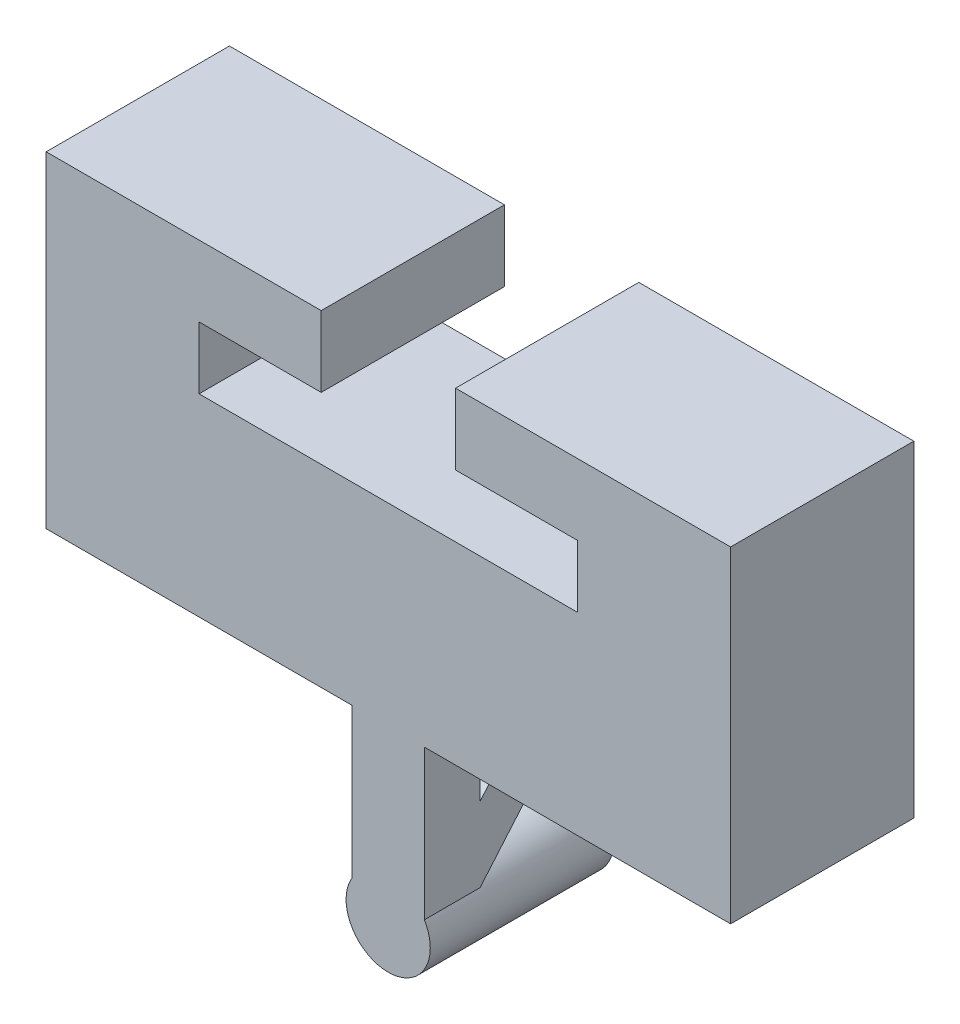
ISO-10303-21;
HEADER;
FILE_DESCRIPTION(('STEP AP214'),'2;1');
FILE_NAME('part.step','',(''),(''),'','','');
FILE_SCHEMA(('AUTOMOTIVE_DESIGN { 1 0 10303 214 1 1 1 1 }'));
ENDSEC;
DATA;
#1=APPLICATION_CONTEXT('core data for automotive mechanical design processes');
#2=APPLICATION_PROTOCOL_DEFINITION('international standard','automotive_design',2000,#1);
#3=PRODUCT_CONTEXT('',#1,'mechanical');
#4=PRODUCT('Part','Part','',(#3));
#5=PRODUCT_RELATED_PRODUCT_CATEGORY('part','',(#4));
#6=PRODUCT_DEFINITION_FORMATION('','',#4);
#7=PRODUCT_DEFINITION_CONTEXT('part definition',#1,'design');
#8=PRODUCT_DEFINITION('design','',#6,#7);
#9=PRODUCT_DEFINITION_SHAPE('','',#8);
#10=(LENGTH_UNIT() NAMED_UNIT(*) SI_UNIT(.MILLI.,.METRE.));
#11=(NAMED_UNIT(*) PLANE_ANGLE_UNIT() SI_UNIT($,.RADIAN.));
#12=(NAMED_UNIT(*) SI_UNIT($,.STERADIAN.) SOLID_ANGLE_UNIT());
#13=UNCERTAINTY_MEASURE_WITH_UNIT(LENGTH_MEASURE(1.E-05),#10,'distance_accuracy_value','');
#14=(GEOMETRIC_REPRESENTATION_CONTEXT(3) GLOBAL_UNCERTAINTY_ASSIGNED_CONTEXT((#13)) GLOBAL_UNIT_ASSIGNED_CONTEXT((#10,
#11,#12)) REPRESENTATION_CONTEXT('',''));
#15=CARTESIAN_POINT('',(0.,0.,0.));
#16=DIRECTION('',(0.,0.,1.));
#17=DIRECTION('',(1.,0.,0.));
#18=AXIS2_PLACEMENT_3D('',#15,#16,#17);
#19=CARTESIAN_POINT('',(0.,0.,38.1));
#20=DIRECTION('',(0.,1.,0.));
#21=DIRECTION('',(0.,0.,1.));
#22=AXIS2_PLACEMENT_3D('',#19,#20,#21);
#23=PLANE('',#22);
#24=DIRECTION('',(1.,0.,0.));
#25=VECTOR('',#24,1.);
#26=CARTESIAN_POINT('',(0.,0.,0.));
#27=LINE('',#26,#25);
#28=CARTESIAN_POINT('',(0.,0.,0.));
#29=VERTEX_POINT('',#28);
#30=CARTESIAN_POINT('',(63.4079942270176,0.,0.));
#31=VERTEX_POINT('',#30);
#32=EDGE_CURVE('E291',#29,#31,#27,.T.);
#33=ORIENTED_EDGE('',*,*,#32,.T.);
#34=DIRECTION('',(0.,0.,1.));
#35=VECTOR('',#34,1.);
#36=CARTESIAN_POINT('',(63.4079942270176,0.,0.));
#37=LINE('',#36,#35);
#38=CARTESIAN_POINT('',(63.4079942270176,0.,13.2638594013395));
#39=VERTEX_POINT('',#38);
#40=EDGE_CURVE('E66',#31,#39,#37,.T.);
#41=ORIENTED_EDGE('',*,*,#40,.T.);
#42=DIRECTION('',(1.,0.,0.));
#43=VECTOR('',#42,1.);
#44=CARTESIAN_POINT('',(63.4079942270176,0.,13.2638594013395));
#45=LINE('',#44,#43);
#46=CARTESIAN_POINT('',(78.6479942270176,0.,13.2638594013395));
#47=VERTEX_POINT('',#46);
#48=EDGE_CURVE('E70',#39,#47,#45,.T.);
#49=ORIENTED_EDGE('',*,*,#48,.T.);
#50=DIRECTION('',(0.,0.,1.));
#51=VECTOR('',#50,1.);
#52=CARTESIAN_POINT('',(78.6479942270176,0.,0.));
#53=LINE('',#52,#51);
#54=CARTESIAN_POINT('',(78.6479942270176,0.,0.));
#55=VERTEX_POINT('',#54);
#56=EDGE_CURVE('E213',#55,#47,#53,.T.);
#57=ORIENTED_EDGE('',*,*,#56,.F.);
#58=CARTESIAN_POINT('',(142.319474342929,0.,0.));
#59=VERTEX_POINT('',#58);
#60=EDGE_CURVE('E290',#55,#59,#27,.T.);
#61=ORIENTED_EDGE('',*,*,#60,.T.);
#62=DIRECTION('',(0.,0.,-1.));
#63=VECTOR('',#62,1.);
#64=CARTESIAN_POINT('',(142.319474342929,0.,38.1));
#65=LINE('',#64,#63);
#66=CARTESIAN_POINT('',(142.319474342929,0.,38.1));
#67=VERTEX_POINT('',#66);
#68=EDGE_CURVE('E341',#67,#59,#65,.T.);
#69=ORIENTED_EDGE('',*,*,#68,.F.);
#70=DIRECTION('',(1.,0.,0.));
#71=VECTOR('',#70,1.);
#72=CARTESIAN_POINT('',(0.,0.,38.1));
#73=LINE('',#72,#71);
#74=CARTESIAN_POINT('',(78.6479942270176,0.,38.1));
#75=VERTEX_POINT('',#74);
#76=EDGE_CURVE('E262',#75,#67,#73,.T.);
#77=ORIENTED_EDGE('',*,*,#76,.F.);
#78=DIRECTION('',(0.,0.,1.));
#79=VECTOR('',#78,1.);
#80=CARTESIAN_POINT('',(78.6479942270176,0.,26.5277188026789));
#81=LINE('',#80,#79);
#82=CARTESIAN_POINT('',(78.6479942270176,0.,26.5277188026789));
#83=VERTEX_POINT('',#82);
#84=EDGE_CURVE('E247',#83,#75,#81,.T.);
#85=ORIENTED_EDGE('',*,*,#84,.F.);
#86=DIRECTION('',(-1.,0.,0.));
#87=VECTOR('',#86,1.);
#88=CARTESIAN_POINT('',(78.6479942270176,0.,26.5277188026789));
#89=LINE('',#88,#87);
#90=CARTESIAN_POINT('',(63.592005809709,0.,26.5277188026789));
#91=VERTEX_POINT('',#90);
#92=EDGE_CURVE('E239',#83,#91,#89,.T.);
#93=ORIENTED_EDGE('',*,*,#92,.T.);
#94=DIRECTION('',(0.,0.,1.));
#95=VECTOR('',#94,1.);
#96=CARTESIAN_POINT('',(63.592005809709,0.,26.5277188026789));
#97=LINE('',#96,#95);
#98=CARTESIAN_POINT('',(63.592005809709,0.,38.1));
#99=VERTEX_POINT('',#98);
#100=EDGE_CURVE('E253',#91,#99,#97,.T.);
#101=ORIENTED_EDGE('',*,*,#100,.T.);
#102=CARTESIAN_POINT('',(0.,0.,38.1));
#103=VERTEX_POINT('',#102);
#104=EDGE_CURVE('E264',#103,#99,#73,.T.);
#105=ORIENTED_EDGE('',*,*,#104,.F.);
#106=DIRECTION('',(0.,0.,-1.));
#107=VECTOR('',#106,1.);
#108=CARTESIAN_POINT('',(0.,0.,38.1));
#109=LINE('',#108,#107);
#110=EDGE_CURVE('E59',#103,#29,#109,.T.);
#111=ORIENTED_EDGE('',*,*,#110,.T.);
#112=EDGE_LOOP('',(#33,#41,#49,#57,#61,#69,#77,#85,#93,#101,#105,#111));
#113=FACE_BOUND('',#112,.T.);
#114=ADVANCED_FACE('F51',(#113),#23,.F.);
#115=CARTESIAN_POINT('',(0.,67.883016850886,38.1));
#116=DIRECTION('',(1.,0.,0.));
#117=DIRECTION('',(0.,0.,-1.));
#118=AXIS2_PLACEMENT_3D('',#115,#116,#117);
#119=PLANE('',#118);
#120=DIRECTION('',(0.,-1.,0.));
#121=VECTOR('',#120,1.);
#122=CARTESIAN_POINT('',(0.,67.883016850886,0.));
#123=LINE('',#122,#121);
#124=CARTESIAN_POINT('',(0.,67.883016850886,0.));
#125=VERTEX_POINT('',#124);
#126=EDGE_CURVE('E256',#125,#29,#123,.T.);
#127=ORIENTED_EDGE('',*,*,#126,.T.);
#128=ORIENTED_EDGE('',*,*,#110,.F.);
#129=DIRECTION('',(0.,-1.,0.));
#130=VECTOR('',#129,1.);
#131=CARTESIAN_POINT('',(0.,67.883016850886,38.1));
#132=LINE('',#131,#130);
#133=CARTESIAN_POINT('',(0.,67.883016850886,38.1));
#134=VERTEX_POINT('',#133);
#135=EDGE_CURVE('E259',#134,#103,#132,.T.);
#136=ORIENTED_EDGE('',*,*,#135,.F.);
#137=DIRECTION('',(0.,0.,-1.));
#138=VECTOR('',#137,1.);
#139=CARTESIAN_POINT('',(0.,67.883016850886,38.1));
#140=LINE('',#139,#138);
#141=EDGE_CURVE('E287',#134,#125,#140,.T.);
#142=ORIENTED_EDGE('',*,*,#141,.T.);
#143=EDGE_LOOP('',(#127,#128,#136,#142));
#144=FACE_BOUND('',#143,.T.);
#145=ADVANCED_FACE('F53',(#144),#119,.F.);
#146=CARTESIAN_POINT('',(142.319474342929,0.,38.1));
#147=DIRECTION('',(-1.,0.,0.));
#148=DIRECTION('',(0.,0.,1.));
#149=AXIS2_PLACEMENT_3D('',#146,#147,#148);
#150=PLANE('',#149);
#151=DIRECTION('',(0.,1.,0.));
#152=VECTOR('',#151,1.);
#153=CARTESIAN_POINT('',(142.319474342929,0.,0.));
#154=LINE('',#153,#152);
#155=CARTESIAN_POINT('',(142.319474342929,67.883016850886,0.));
#156=VERTEX_POINT('',#155);
#157=EDGE_CURVE('E293',#59,#156,#154,.T.);
#158=ORIENTED_EDGE('',*,*,#157,.T.);
#159=DIRECTION('',(0.,0.,-1.));
#160=VECTOR('',#159,1.);
#161=CARTESIAN_POINT('',(142.319474342929,67.883016850886,38.1));
#162=LINE('',#161,#160);
#163=CARTESIAN_POINT('',(142.319474342929,67.883016850886,38.1));
#164=VERTEX_POINT('',#163);
#165=EDGE_CURVE('E338',#164,#156,#162,.T.);
#166=ORIENTED_EDGE('',*,*,#165,.F.);
#167=DIRECTION('',(0.,1.,0.));
#168=VECTOR('',#167,1.);
#169=CARTESIAN_POINT('',(142.319474342929,0.,38.1));
#170=LINE('',#169,#168);
#171=EDGE_CURVE('E267',#67,#164,#170,.T.);
#172=ORIENTED_EDGE('',*,*,#171,.F.);
#173=ORIENTED_EDGE('',*,*,#68,.T.);
#174=EDGE_LOOP('',(#158,#166,#172,#173));
#175=FACE_BOUND('',#174,.T.);
#176=ADVANCED_FACE('F412',(#175),#150,.F.);
#177=CARTESIAN_POINT('',(142.319474342929,67.883016850886,38.1));
#178=DIRECTION('',(0.,-1.,0.));
#179=DIRECTION('',(0.,0.,-1.));
#180=AXIS2_PLACEMENT_3D('',#177,#178,#179);
#181=PLANE('',#180);
#182=DIRECTION('',(-1.,0.,0.));
#183=VECTOR('',#182,1.);
#184=CARTESIAN_POINT('',(142.319474342929,67.883016850886,0.));
#185=LINE('',#184,#183);
#186=CARTESIAN_POINT('',(85.1297371714643,67.883016850886,0.));
#187=VERTEX_POINT('',#186);
#188=EDGE_CURVE('E295',#156,#187,#185,.T.);
#189=ORIENTED_EDGE('',*,*,#188,.T.);
#190=DIRECTION('',(0.,0.,-1.));
#191=VECTOR('',#190,1.);
#192=CARTESIAN_POINT('',(85.1297371714643,67.883016850886,38.1));
#193=LINE('',#192,#191);
#194=CARTESIAN_POINT('',(85.1297371714643,67.883016850886,38.1));
#195=VERTEX_POINT('',#194);
#196=EDGE_CURVE('E335',#195,#187,#193,.T.);
#197=ORIENTED_EDGE('',*,*,#196,.F.);
#198=DIRECTION('',(-1.,0.,0.));
#199=VECTOR('',#198,1.);
#200=CARTESIAN_POINT('',(142.319474342929,67.883016850886,38.1));
#201=LINE('',#200,#199);
#202=EDGE_CURVE('E269',#164,#195,#201,.T.);
#203=ORIENTED_EDGE('',*,*,#202,.F.);
#204=ORIENTED_EDGE('',*,*,#165,.T.);
#205=EDGE_LOOP('',(#189,#197,#203,#204));
#206=FACE_BOUND('',#205,.T.);
#207=ADVANCED_FACE('F407',(#206),#181,.F.);
#208=CARTESIAN_POINT('',(85.1297371714643,67.883016850886,38.1));
#209=DIRECTION('',(1.,0.,0.));
#210=DIRECTION('',(0.,0.,-1.));
#211=AXIS2_PLACEMENT_3D('',#208,#209,#210);
#212=PLANE('',#211);
#213=DIRECTION('',(0.,-1.,0.));
#214=VECTOR('',#213,1.);
#215=CARTESIAN_POINT('',(85.1297371714643,67.883016850886,0.));
#216=LINE('',#215,#214);
#217=CARTESIAN_POINT('',(85.1297371714643,53.1441387077525,0.));
#218=VERTEX_POINT('',#217);
#219=EDGE_CURVE('E297',#187,#218,#216,.T.);
#220=ORIENTED_EDGE('',*,*,#219,.T.);
#221=DIRECTION('',(0.,0.,-1.));
#222=VECTOR('',#221,1.);
#223=CARTESIAN_POINT('',(85.1297371714643,53.1441387077525,38.1));
#224=LINE('',#223,#222);
#225=CARTESIAN_POINT('',(85.1297371714643,53.1441387077525,38.1));
#226=VERTEX_POINT('',#225);
#227=EDGE_CURVE('E332',#226,#218,#224,.T.);
#228=ORIENTED_EDGE('',*,*,#227,.F.);
#229=DIRECTION('',(0.,-1.,0.));
#230=VECTOR('',#229,1.);
#231=CARTESIAN_POINT('',(85.1297371714643,67.883016850886,38.1));
#232=LINE('',#231,#230);
#233=EDGE_CURVE('E271',#195,#226,#232,.T.);
#234=ORIENTED_EDGE('',*,*,#233,.F.);
#235=ORIENTED_EDGE('',*,*,#196,.T.);
#236=EDGE_LOOP('',(#220,#228,#234,#235));
#237=FACE_BOUND('',#236,.T.);
#238=ADVANCED_FACE('F403',(#237),#212,.F.);
#239=CARTESIAN_POINT('',(85.1297371714643,53.1441387077525,38.1));
#240=DIRECTION('',(0.,1.,0.));
#241=DIRECTION('',(0.,0.,1.));
#242=AXIS2_PLACEMENT_3D('',#239,#240,#241);
#243=PLANE('',#242);
#244=DIRECTION('',(1.,0.,0.));
#245=VECTOR('',#244,1.);
#246=CARTESIAN_POINT('',(85.1297371714643,53.1441387077525,0.));
#247=LINE('',#246,#245);
#248=CARTESIAN_POINT('',(110.529737171464,53.1441387077525,0.));
#249=VERTEX_POINT('',#248);
#250=EDGE_CURVE('E299',#218,#249,#247,.T.);
#251=ORIENTED_EDGE('',*,*,#250,.T.);
#252=DIRECTION('',(0.,0.,-1.));
#253=VECTOR('',#252,1.);
#254=CARTESIAN_POINT('',(110.529737171464,53.1441387077525,38.1));
#255=LINE('',#254,#253);
#256=CARTESIAN_POINT('',(110.529737171464,53.1441387077525,38.1));
#257=VERTEX_POINT('',#256);
#258=EDGE_CURVE('E329',#257,#249,#255,.T.);
#259=ORIENTED_EDGE('',*,*,#258,.F.);
#260=DIRECTION('',(1.,0.,0.));
#261=VECTOR('',#260,1.);
#262=CARTESIAN_POINT('',(85.1297371714643,53.1441387077525,38.1));
#263=LINE('',#262,#261);
#264=EDGE_CURVE('E273',#226,#257,#263,.T.);
#265=ORIENTED_EDGE('',*,*,#264,.F.);
#266=ORIENTED_EDGE('',*,*,#227,.T.);
#267=EDGE_LOOP('',(#251,#259,#265,#266));
#268=FACE_BOUND('',#267,.T.);
#269=ADVANCED_FACE('F399',(#268),#243,.F.);
#270=CARTESIAN_POINT('',(110.529737171464,53.1441387077525,38.1));
#271=DIRECTION('',(1.,0.,0.));
#272=DIRECTION('',(0.,0.,-1.));
#273=AXIS2_PLACEMENT_3D('',#270,#271,#272);
#274=PLANE('',#273);
#275=DIRECTION('',(0.,-1.,0.));
#276=VECTOR('',#275,1.);
#277=CARTESIAN_POINT('',(110.529737171464,53.1441387077525,0.));
#278=LINE('',#277,#276);
#279=CARTESIAN_POINT('',(110.529737171464,40.1901387077525,0.));
#280=VERTEX_POINT('',#279);
#281=EDGE_CURVE('E301',#249,#280,#278,.T.);
#282=ORIENTED_EDGE('',*,*,#281,.T.);
#283=DIRECTION('',(0.,0.,-1.));
#284=VECTOR('',#283,1.);
#285=CARTESIAN_POINT('',(110.529737171464,40.1901387077525,38.1));
#286=LINE('',#285,#284);
#287=CARTESIAN_POINT('',(110.529737171464,40.1901387077525,38.1));
#288=VERTEX_POINT('',#287);
#289=EDGE_CURVE('E326',#288,#280,#286,.T.);
#290=ORIENTED_EDGE('',*,*,#289,.F.);
#291=DIRECTION('',(0.,-1.,0.));
#292=VECTOR('',#291,1.);
#293=CARTESIAN_POINT('',(110.529737171464,53.1441387077525,38.1));
#294=LINE('',#293,#292);
#295=EDGE_CURVE('E275',#257,#288,#294,.T.);
#296=ORIENTED_EDGE('',*,*,#295,.F.);
#297=ORIENTED_EDGE('',*,*,#258,.T.);
#298=EDGE_LOOP('',(#282,#290,#296,#297));
#299=FACE_BOUND('',#298,.T.);
#300=ADVANCED_FACE('F394',(#299),#274,.F.);
#301=CARTESIAN_POINT('',(110.529737171464,40.1901387077525,38.1));
#302=DIRECTION('',(0.,-1.,0.));
#303=DIRECTION('',(1.,0.,0.));
#304=AXIS2_PLACEMENT_3D('',#301,#302,#303);
#305=PLANE('',#304);
#306=DIRECTION('',(-1.,0.,0.));
#307=VECTOR('',#306,1.);
#308=CARTESIAN_POINT('',(110.529737171464,40.1901387077525,0.));
#309=LINE('',#308,#307);
#310=CARTESIAN_POINT('',(31.7897371714643,40.1901387077525,0.));
#311=VERTEX_POINT('',#310);
#312=EDGE_CURVE('E303',#280,#311,#309,.T.);
#313=ORIENTED_EDGE('',*,*,#312,.T.);
#314=DIRECTION('',(0.,0.,-1.));
#315=VECTOR('',#314,1.);
#316=CARTESIAN_POINT('',(31.7897371714643,40.1901387077525,38.1));
#317=LINE('',#316,#315);
#318=CARTESIAN_POINT('',(31.7897371714643,40.1901387077525,38.1));
#319=VERTEX_POINT('',#318);
#320=EDGE_CURVE('E323',#319,#311,#317,.T.);
#321=ORIENTED_EDGE('',*,*,#320,.F.);
#322=DIRECTION('',(-1.,0.,0.));
#323=VECTOR('',#322,1.);
#324=CARTESIAN_POINT('',(110.529737171464,40.1901387077525,38.1));
#325=LINE('',#324,#323);
#326=EDGE_CURVE('E277',#288,#319,#325,.T.);
#327=ORIENTED_EDGE('',*,*,#326,.F.);
#328=ORIENTED_EDGE('',*,*,#289,.T.);
#329=EDGE_LOOP('',(#313,#321,#327,#328));
#330=FACE_BOUND('',#329,.T.);
#331=ADVANCED_FACE('F388',(#330),#305,.F.);
#332=CARTESIAN_POINT('',(31.7897371714643,40.1901387077525,38.1));
#333=DIRECTION('',(-1.,0.,0.));
#334=DIRECTION('',(0.,0.,1.));
#335=AXIS2_PLACEMENT_3D('',#332,#333,#334);
#336=PLANE('',#335);
#337=DIRECTION('',(0.,1.,0.));
#338=VECTOR('',#337,1.);
#339=CARTESIAN_POINT('',(31.7897371714643,40.1901387077525,0.));
#340=LINE('',#339,#338);
#341=CARTESIAN_POINT('',(31.7897371714643,53.1441387077525,0.));
#342=VERTEX_POINT('',#341);
#343=EDGE_CURVE('E305',#311,#342,#340,.T.);
#344=ORIENTED_EDGE('',*,*,#343,.T.);
#345=DIRECTION('',(0.,0.,-1.));
#346=VECTOR('',#345,1.);
#347=CARTESIAN_POINT('',(31.7897371714643,53.1441387077525,38.1));
#348=LINE('',#347,#346);
#349=CARTESIAN_POINT('',(31.7897371714643,53.1441387077525,38.1));
#350=VERTEX_POINT('',#349);
#351=EDGE_CURVE('E320',#350,#342,#348,.T.);
#352=ORIENTED_EDGE('',*,*,#351,.F.);
#353=DIRECTION('',(0.,1.,0.));
#354=VECTOR('',#353,1.);
#355=CARTESIAN_POINT('',(31.7897371714643,40.1901387077525,38.1));
#356=LINE('',#355,#354);
#357=EDGE_CURVE('E279',#319,#350,#356,.T.);
#358=ORIENTED_EDGE('',*,*,#357,.F.);
#359=ORIENTED_EDGE('',*,*,#320,.T.);
#360=EDGE_LOOP('',(#344,#352,#358,#359));
#361=FACE_BOUND('',#360,.T.);
#362=ADVANCED_FACE('F384',(#361),#336,.F.);
#363=CARTESIAN_POINT('',(31.7897371714643,53.1441387077525,38.1));
#364=DIRECTION('',(0.,1.,0.));
#365=DIRECTION('',(0.,0.,1.));
#366=AXIS2_PLACEMENT_3D('',#363,#364,#365);
#367=PLANE('',#366);
#368=DIRECTION('',(1.,0.,0.));
#369=VECTOR('',#368,1.);
#370=CARTESIAN_POINT('',(31.7897371714643,53.1441387077525,0.));
#371=LINE('',#370,#369);
#372=CARTESIAN_POINT('',(57.1897371714643,53.1441387077525,0.));
#373=VERTEX_POINT('',#372);
#374=EDGE_CURVE('E307',#342,#373,#371,.T.);
#375=ORIENTED_EDGE('',*,*,#374,.T.);
#376=DIRECTION('',(0.,0.,-1.));
#377=VECTOR('',#376,1.);
#378=CARTESIAN_POINT('',(57.1897371714643,53.1441387077525,38.1));
#379=LINE('',#378,#377);
#380=CARTESIAN_POINT('',(57.1897371714643,53.1441387077525,38.1));
#381=VERTEX_POINT('',#380);
#382=EDGE_CURVE('E317',#381,#373,#379,.T.);
#383=ORIENTED_EDGE('',*,*,#382,.F.);
#384=DIRECTION('',(1.,0.,0.));
#385=VECTOR('',#384,1.);
#386=CARTESIAN_POINT('',(31.7897371714643,53.1441387077525,38.1));
#387=LINE('',#386,#385);
#388=EDGE_CURVE('E281',#350,#381,#387,.T.);
#389=ORIENTED_EDGE('',*,*,#388,.F.);
#390=ORIENTED_EDGE('',*,*,#351,.T.);
#391=EDGE_LOOP('',(#375,#383,#389,#390));
#392=FACE_BOUND('',#391,.T.);
#393=ADVANCED_FACE('F379',(#392),#367,.F.);
#394=CARTESIAN_POINT('',(57.1897371714643,53.1441387077525,38.1));
#395=DIRECTION('',(-1.,0.,0.));
#396=DIRECTION('',(0.,-1.,0.));
#397=AXIS2_PLACEMENT_3D('',#394,#395,#396);
#398=PLANE('',#397);
#399=DIRECTION('',(0.,1.,0.));
#400=VECTOR('',#399,1.);
#401=CARTESIAN_POINT('',(57.1897371714643,53.1441387077525,0.));
#402=LINE('',#401,#400);
#403=CARTESIAN_POINT('',(57.1897371714643,67.883016850886,0.));
#404=VERTEX_POINT('',#403);
#405=EDGE_CURVE('E309',#373,#404,#402,.T.);
#406=ORIENTED_EDGE('',*,*,#405,.T.);
#407=DIRECTION('',(0.,0.,-1.));
#408=VECTOR('',#407,1.);
#409=CARTESIAN_POINT('',(57.1897371714643,67.883016850886,38.1));
#410=LINE('',#409,#408);
#411=CARTESIAN_POINT('',(57.1897371714643,67.883016850886,38.1));
#412=VERTEX_POINT('',#411);
#413=EDGE_CURVE('E314',#412,#404,#410,.T.);
#414=ORIENTED_EDGE('',*,*,#413,.F.);
#415=DIRECTION('',(0.,1.,0.));
#416=VECTOR('',#415,1.);
#417=CARTESIAN_POINT('',(57.1897371714643,53.1441387077525,38.1));
#418=LINE('',#417,#416);
#419=EDGE_CURVE('E283',#381,#412,#418,.T.);
#420=ORIENTED_EDGE('',*,*,#419,.F.);
#421=ORIENTED_EDGE('',*,*,#382,.T.);
#422=EDGE_LOOP('',(#406,#414,#420,#421));
#423=FACE_BOUND('',#422,.T.);
#424=ADVANCED_FACE('F373',(#423),#398,.F.);
#425=CARTESIAN_POINT('',(57.1897371714643,67.883016850886,38.1));
#426=DIRECTION('',(0.,-1.,0.));
#427=DIRECTION('',(1.,0.,0.));
#428=AXIS2_PLACEMENT_3D('',#425,#426,#427);
#429=PLANE('',#428);
#430=DIRECTION('',(-1.,0.,0.));
#431=VECTOR('',#430,1.);
#432=CARTESIAN_POINT('',(57.1897371714643,67.883016850886,0.));
#433=LINE('',#432,#431);
#434=EDGE_CURVE('E263',#404,#125,#433,.T.);
#435=ORIENTED_EDGE('',*,*,#434,.T.);
#436=ORIENTED_EDGE('',*,*,#141,.F.);
#437=DIRECTION('',(-1.,0.,0.));
#438=VECTOR('',#437,1.);
#439=CARTESIAN_POINT('',(57.1897371714643,67.883016850886,38.1));
#440=LINE('',#439,#438);
#441=EDGE_CURVE('E285',#412,#134,#440,.T.);
#442=ORIENTED_EDGE('',*,*,#441,.F.);
#443=ORIENTED_EDGE('',*,*,#413,.T.);
#444=EDGE_LOOP('',(#435,#436,#442,#443));
#445=FACE_BOUND('',#444,.T.);
#446=ADVANCED_FACE('F371',(#445),#429,.F.);
#447=CARTESIAN_POINT('',(0.,0.,38.1));
#448=DIRECTION('',(0.,0.,1.));
#449=DIRECTION('',(1.,0.,0.));
#450=AXIS2_PLACEMENT_3D('',#447,#448,#449);
#451=PLANE('',#450);
#452=DIRECTION('',(0.,-1.,0.));
#453=VECTOR('',#452,1.);
#454=CARTESIAN_POINT('',(63.592005809709,-40.0205890994918,38.1));
#455=LINE('',#454,#453);
#456=CARTESIAN_POINT('',(63.592005809709,-31.0993664955218,38.1));
#457=VERTEX_POINT('',#456);
#458=EDGE_CURVE('E240',#99,#457,#455,.T.);
#459=ORIENTED_EDGE('',*,*,#458,.T.);
#460=CARTESIAN_POINT('',(71.1200000248106,-35.5599777975068,38.1));
#461=DIRECTION('',(0.,0.,1.));
#462=DIRECTION('',(1.,0.,0.));
#463=AXIS2_PLACEMENT_3D('',#460,#461,#462);
#464=CIRCLE('',#463,8.75030000000001);
#465=CARTESIAN_POINT('',(78.6479942270176,-31.09936647376,38.1));
#466=VERTEX_POINT('',#465);
#467=EDGE_CURVE('E234',#457,#466,#464,.T.);
#468=ORIENTED_EDGE('',*,*,#467,.T.);
#469=DIRECTION('',(0.,1.,0.));
#470=VECTOR('',#469,1.);
#471=CARTESIAN_POINT('',(78.6479942270176,-40.0205891212536,38.1));
#472=LINE('',#471,#470);
#473=EDGE_CURVE('E249',#466,#75,#472,.T.);
#474=ORIENTED_EDGE('',*,*,#473,.T.);
#475=ORIENTED_EDGE('',*,*,#76,.T.);
#476=ORIENTED_EDGE('',*,*,#171,.T.);
#477=ORIENTED_EDGE('',*,*,#202,.T.);
#478=ORIENTED_EDGE('',*,*,#233,.T.);
#479=ORIENTED_EDGE('',*,*,#264,.T.);
#480=ORIENTED_EDGE('',*,*,#295,.T.);
#481=ORIENTED_EDGE('',*,*,#326,.T.);
#482=ORIENTED_EDGE('',*,*,#357,.T.);
#483=ORIENTED_EDGE('',*,*,#388,.T.);
#484=ORIENTED_EDGE('',*,*,#419,.T.);
#485=ORIENTED_EDGE('',*,*,#441,.T.);
#486=ORIENTED_EDGE('',*,*,#135,.T.);
#487=ORIENTED_EDGE('',*,*,#104,.T.);
#488=EDGE_LOOP('',(#459,#468,#474,#475,#476,#477,#478,#479,#480,#481,#482,#483,#484,#485,#486,#487));
#489=FACE_BOUND('',#488,.T.);
#490=ADVANCED_FACE('F366',(#489),#451,.T.);
#491=CARTESIAN_POINT('',(0.,0.,0.));
#492=DIRECTION('',(0.,0.,1.));
#493=DIRECTION('',(1.,0.,0.));
#494=AXIS2_PLACEMENT_3D('',#491,#492,#493);
#495=PLANE('',#494);
#496=ORIENTED_EDGE('',*,*,#126,.F.);
#497=ORIENTED_EDGE('',*,*,#434,.F.);
#498=ORIENTED_EDGE('',*,*,#405,.F.);
#499=ORIENTED_EDGE('',*,*,#374,.F.);
#500=ORIENTED_EDGE('',*,*,#343,.F.);
#501=ORIENTED_EDGE('',*,*,#312,.F.);
#502=ORIENTED_EDGE('',*,*,#281,.F.);
#503=ORIENTED_EDGE('',*,*,#250,.F.);
#504=ORIENTED_EDGE('',*,*,#219,.F.);
#505=ORIENTED_EDGE('',*,*,#188,.F.);
#506=ORIENTED_EDGE('',*,*,#157,.F.);
#507=ORIENTED_EDGE('',*,*,#60,.F.);
#508=DIRECTION('',(1.,0.,0.));
#509=VECTOR('',#508,1.);
#510=CARTESIAN_POINT('',(63.4079942270176,0.,0.));
#511=LINE('',#510,#509);
#512=EDGE_CURVE('E198',#31,#55,#511,.T.);
#513=ORIENTED_EDGE('',*,*,#512,.F.);
#514=ORIENTED_EDGE('',*,*,#32,.F.);
#515=EDGE_LOOP('',(#496,#497,#498,#499,#500,#501,#502,#503,#504,#505,#506,#507,#513,#514));
#516=FACE_BOUND('',#515,.T.);
#517=ADVANCED_FACE('F351',(#516),#495,.F.);
#518=CARTESIAN_POINT('',(71.1200000248106,-35.5599777975068,26.5277188026789));
#519=DIRECTION('',(0.,0.,1.));
#520=DIRECTION('',(1.,0.,0.));
#521=AXIS2_PLACEMENT_3D('',#518,#519,#520);
#522=CYLINDRICAL_SURFACE('',#521,8.75030000000001);
#523=CARTESIAN_POINT('',(71.1200000248106,-35.5599777975068,30.3326144099332));
#524=DIRECTION('',(0.,-0.648971934426064,-0.760812347643814));
#525=DIRECTION('',(0.,-0.760812347643814,0.648971934426064));
#526=AXIS2_PLACEMENT_3D('',#523,#524,#525);
#527=ELLIPSE('',#526,11.5012591831601,8.75030000000001);
#528=CARTESIAN_POINT('',(78.6479942270176,-31.09936647376,26.5277188026789));
#529=VERTEX_POINT('',#528);
#530=CARTESIAN_POINT('',(63.592005809709,-31.09936647376,26.5277188026789));
#531=VERTEX_POINT('',#530);
#532=EDGE_CURVE('E194',#529,#531,#527,.F.);
#533=ORIENTED_EDGE('',*,*,#532,.F.);
#534=DIRECTION('',(0.,0.,1.));
#535=VECTOR('',#534,1.);
#536=CARTESIAN_POINT('',(78.6479942270176,-31.09936647376,0.));
#537=LINE('',#536,#535);
#538=EDGE_CURVE('E229',#529,#466,#537,.T.);
#539=ORIENTED_EDGE('',*,*,#538,.T.);
#540=ORIENTED_EDGE('',*,*,#467,.F.);
#541=DIRECTION('',(0.,0.,1.));
#542=VECTOR('',#541,1.);
#543=CARTESIAN_POINT('',(63.592005809709,-31.0993664955218,0.));
#544=LINE('',#543,#542);
#545=EDGE_CURVE('E232',#457,#531,#544,.F.);
#546=ORIENTED_EDGE('',*,*,#545,.T.);
#547=EDGE_LOOP('',(#533,#539,#540,#546));
#548=FACE_BOUND('',#547,.T.);
#549=CARTESIAN_POINT('',(71.1200000248106,-35.5599777975068,0.));
#550=DIRECTION('',(0.,0.,1.));
#551=DIRECTION('',(1.,0.,0.));
#552=AXIS2_PLACEMENT_3D('',#549,#550,#551);
#553=CIRCLE('',#552,8.7503);
#554=CARTESIAN_POINT('',(79.8703000248106,-35.5599777975068,0.));
#555=VERTEX_POINT('',#554);
#556=EDGE_CURVE('E226',#555,#555,#553,.T.);
#557=ORIENTED_EDGE('',*,*,#556,.T.);
#558=EDGE_LOOP('',(#557));
#559=FACE_BOUND('',#558,.T.);
#560=ADVANCED_FACE('F360',(#548,#559),#522,.T.);
#561=CARTESIAN_POINT('',(63.592005809709,-40.0205890994918,26.5277188026789));
#562=DIRECTION('',(-1.,0.,0.));
#563=DIRECTION('',(0.,0.,1.));
#564=AXIS2_PLACEMENT_3D('',#561,#562,#563);
#565=PLANE('',#564);
#566=ORIENTED_EDGE('',*,*,#545,.F.);
#567=ORIENTED_EDGE('',*,*,#458,.F.);
#568=ORIENTED_EDGE('',*,*,#100,.F.);
#569=DIRECTION('',(0.,-1.,0.));
#570=VECTOR('',#569,1.);
#571=CARTESIAN_POINT('',(63.592005809709,-40.0205890994918,26.5277188026789));
#572=LINE('',#571,#570);
#573=CARTESIAN_POINT('',(63.592005809709,-15.54968323688,26.5277188026789));
#574=VERTEX_POINT('',#573);
#575=EDGE_CURVE('E244',#91,#574,#572,.T.);
#576=ORIENTED_EDGE('',*,*,#575,.T.);
#577=EDGE_CURVE('E243',#574,#531,#572,.T.);
#578=ORIENTED_EDGE('',*,*,#577,.T.);
#579=EDGE_LOOP('',(#566,#567,#568,#576,#578));
#580=FACE_BOUND('',#579,.T.);
#581=ADVANCED_FACE('F364',(#580),#565,.T.);
#582=CARTESIAN_POINT('',(78.6479942270176,-40.0205891212536,26.5277188026789));
#583=DIRECTION('',(1.,0.,0.));
#584=DIRECTION('',(0.,0.,-1.));
#585=AXIS2_PLACEMENT_3D('',#582,#583,#584);
#586=PLANE('',#585);
#587=ORIENTED_EDGE('',*,*,#538,.F.);
#588=DIRECTION('',(0.,0.760812347643814,-0.648971934426064));
#589=VECTOR('',#588,1.);
#590=CARTESIAN_POINT('',(78.6479942270176,-31.09936647376,26.5277188026789));
#591=LINE('',#590,#589);
#592=EDGE_CURVE('E218',#529,#55,#591,.T.);
#593=ORIENTED_EDGE('',*,*,#592,.T.);
#594=ORIENTED_EDGE('',*,*,#56,.T.);
#595=DIRECTION('',(0.,-0.760812347643814,0.648971934426064));
#596=VECTOR('',#595,1.);
#597=CARTESIAN_POINT('',(78.6479942270176,0.,13.2638594013395));
#598=LINE('',#597,#596);
#599=CARTESIAN_POINT('',(78.6479942270176,-15.54968323688,26.5277188026789));
#600=VERTEX_POINT('',#599);
#601=EDGE_CURVE('E211',#47,#600,#598,.T.);
#602=ORIENTED_EDGE('',*,*,#601,.T.);
#603=DIRECTION('',(0.,1.,0.));
#604=VECTOR('',#603,1.);
#605=CARTESIAN_POINT('',(78.6479942270176,-40.0205891212536,26.5277188026789));
#606=LINE('',#605,#604);
#607=EDGE_CURVE('E235',#600,#83,#606,.T.);
#608=ORIENTED_EDGE('',*,*,#607,.T.);
#609=ORIENTED_EDGE('',*,*,#84,.T.);
#610=ORIENTED_EDGE('',*,*,#473,.F.);
#611=EDGE_LOOP('',(#587,#593,#594,#602,#608,#609,#610));
#612=FACE_BOUND('',#611,.T.);
#613=ADVANCED_FACE('F356',(#612),#586,.T.);
#614=CARTESIAN_POINT('',(71.1200000248106,-35.5599777975068,26.5277188026789));
#615=DIRECTION('',(0.,0.,1.));
#616=DIRECTION('',(1.,0.,0.));
#617=AXIS2_PLACEMENT_3D('',#614,#615,#616);
#618=PLANE('',#617);
#619=ORIENTED_EDGE('',*,*,#607,.F.);
#620=DIRECTION('',(-1.,0.,0.));
#621=VECTOR('',#620,1.);
#622=CARTESIAN_POINT('',(71.1200000248106,-15.54968323688,26.5277188026789));
#623=LINE('',#622,#621);
#624=EDGE_CURVE('E12',#600,#574,#623,.T.);
#625=ORIENTED_EDGE('',*,*,#624,.T.);
#626=ORIENTED_EDGE('',*,*,#575,.F.);
#627=ORIENTED_EDGE('',*,*,#92,.F.);
#628=EDGE_LOOP('',(#619,#625,#626,#627));
#629=FACE_BOUND('',#628,.T.);
#630=ADVANCED_FACE('F421',(#629),#618,.F.);
#631=CARTESIAN_POINT('',(71.1200000248106,-35.5599777975068,0.));
#632=DIRECTION('',(0.,0.,1.));
#633=DIRECTION('',(1.,0.,0.));
#634=AXIS2_PLACEMENT_3D('',#631,#632,#633);
#635=PLANE('',#634);
#636=ORIENTED_EDGE('',*,*,#556,.F.);
#637=EDGE_LOOP('',(#636));
#638=FACE_BOUND('',#637,.T.);
#639=ADVANCED_FACE('F431',(#638),#635,.F.);
#640=CARTESIAN_POINT('',(63.4079942270176,-15.54968323688,26.5277188026789));
#641=DIRECTION('',(0.,0.,1.));
#642=DIRECTION('',(1.,0.,0.));
#643=AXIS2_PLACEMENT_3D('',#640,#641,#642);
#644=PLANE('',#643);
#645=DIRECTION('',(1.,0.,0.));
#646=VECTOR('',#645,1.);
#647=CARTESIAN_POINT('',(63.4079942270176,-31.09936647376,26.5277188026789));
#648=LINE('',#647,#646);
#649=CARTESIAN_POINT('',(63.4079942270176,-31.09936647376,26.5277188026789));
#650=VERTEX_POINT('',#649);
#651=EDGE_CURVE('E188',#650,#531,#648,.T.);
#652=ORIENTED_EDGE('',*,*,#651,.T.);
#653=ORIENTED_EDGE('',*,*,#577,.F.);
#654=DIRECTION('',(1.,0.,0.));
#655=VECTOR('',#654,1.);
#656=CARTESIAN_POINT('',(63.4079942270176,-15.54968323688,26.5277188026789));
#657=LINE('',#656,#655);
#658=CARTESIAN_POINT('',(63.4079942270176,-15.54968323688,26.5277188026789));
#659=VERTEX_POINT('',#658);
#660=EDGE_CURVE('E210',#659,#574,#657,.T.);
#661=ORIENTED_EDGE('',*,*,#660,.F.);
#662=DIRECTION('',(0.,-1.,0.));
#663=VECTOR('',#662,1.);
#664=CARTESIAN_POINT('',(63.4079942270176,-15.54968323688,26.5277188026789));
#665=LINE('',#664,#663);
#666=EDGE_CURVE('E205',#659,#650,#665,.T.);
#667=ORIENTED_EDGE('',*,*,#666,.T.);
#668=EDGE_LOOP('',(#652,#653,#661,#667));
#669=FACE_BOUND('',#668,.T.);
#670=ADVANCED_FACE('F208',(#669),#644,.T.);
#671=CARTESIAN_POINT('',(63.4079942270176,0.,13.2638594013395));
#672=DIRECTION('',(0.,0.648971934426064,0.760812347643814));
#673=DIRECTION('',(0.,-0.760812347643814,0.648971934426064));
#674=AXIS2_PLACEMENT_3D('',#671,#672,#673);
#675=PLANE('',#674);
#676=ORIENTED_EDGE('',*,*,#601,.F.);
#677=ORIENTED_EDGE('',*,*,#48,.F.);
#678=DIRECTION('',(0.,-0.760812347643814,0.648971934426064));
#679=VECTOR('',#678,1.);
#680=CARTESIAN_POINT('',(63.4079942270176,0.,13.2638594013395));
#681=LINE('',#680,#679);
#682=EDGE_CURVE('E199',#39,#659,#681,.T.);
#683=ORIENTED_EDGE('',*,*,#682,.T.);
#684=ORIENTED_EDGE('',*,*,#660,.T.);
#685=ORIENTED_EDGE('',*,*,#624,.F.);
#686=EDGE_LOOP('',(#676,#677,#683,#684,#685));
#687=FACE_BOUND('',#686,.T.);
#688=ADVANCED_FACE('F423',(#687),#675,.T.);
#689=CARTESIAN_POINT('',(63.4079942270176,-31.09936647376,26.5277188026789));
#690=DIRECTION('',(0.,-0.648971934426064,-0.760812347643814));
#691=DIRECTION('',(0.,0.760812347643814,-0.648971934426064));
#692=AXIS2_PLACEMENT_3D('',#689,#690,#691);
#693=PLANE('',#692);
#694=ORIENTED_EDGE('',*,*,#592,.F.);
#695=ORIENTED_EDGE('',*,*,#532,.T.);
#696=ORIENTED_EDGE('',*,*,#651,.F.);
#697=DIRECTION('',(0.,0.760812347643814,-0.648971934426064));
#698=VECTOR('',#697,1.);
#699=CARTESIAN_POINT('',(63.4079942270176,-31.09936647376,26.5277188026789));
#700=LINE('',#699,#698);
#701=EDGE_CURVE('E192',#650,#31,#700,.T.);
#702=ORIENTED_EDGE('',*,*,#701,.T.);
#703=ORIENTED_EDGE('',*,*,#512,.T.);
#704=EDGE_LOOP('',(#694,#695,#696,#702,#703));
#705=FACE_BOUND('',#704,.T.);
#706=ADVANCED_FACE('F190',(#705),#693,.T.);
#707=CARTESIAN_POINT('',(63.4079942270176,0.,0.));
#708=DIRECTION('',(-1.,0.,0.));
#709=DIRECTION('',(0.,0.,1.));
#710=AXIS2_PLACEMENT_3D('',#707,#708,#709);
#711=PLANE('',#710);
#712=ORIENTED_EDGE('',*,*,#666,.F.);
#713=ORIENTED_EDGE('',*,*,#682,.F.);
#714=ORIENTED_EDGE('',*,*,#40,.F.);
#715=ORIENTED_EDGE('',*,*,#701,.F.);
#716=EDGE_LOOP('',(#712,#713,#714,#715));
#717=FACE_BOUND('',#716,.T.);
#718=ADVANCED_FACE('F203',(#717),#711,.T.);
#719=CLOSED_SHELL('',(#114,#145,#176,#207,#238,#269,#300,#331,#362,#393,#424,#446,#490,#517,
#560,#581,#613,#630,#639,#670,#688,#706,#718));
#720=MANIFOLD_SOLID_BREP('B2',#719);
#721=ADVANCED_BREP_SHAPE_REPRESENTATION('',(#18,#720),#14);
#722=SHAPE_DEFINITION_REPRESENTATION(#9,#721);
ENDSEC;
END-ISO-10303-21;
